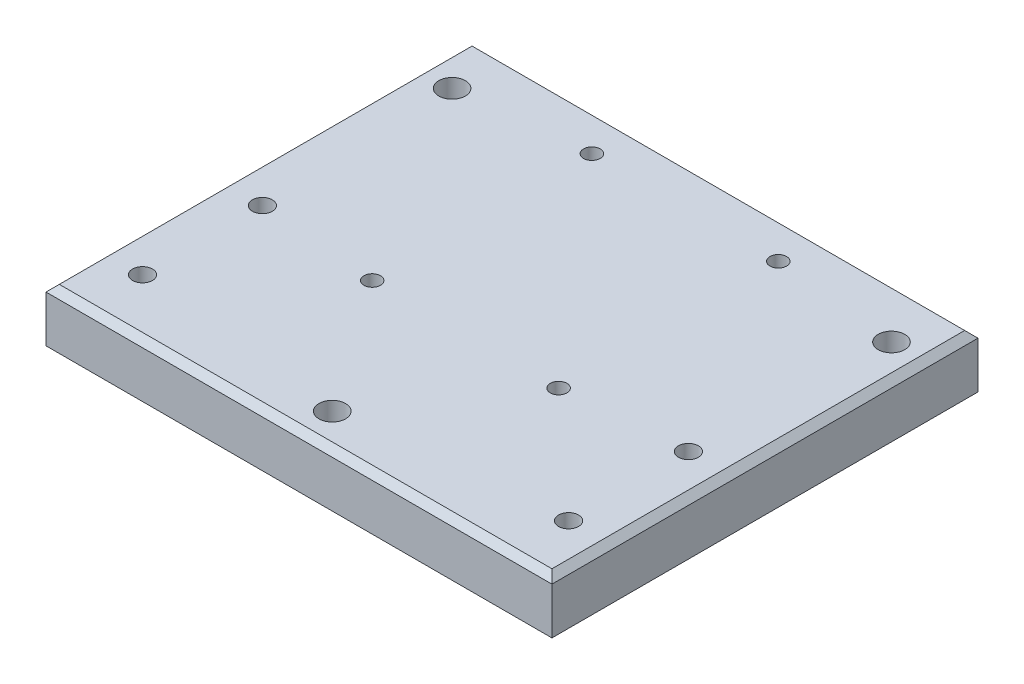
ISO-10303-21;
HEADER;
FILE_DESCRIPTION(('STEP AP214'),'2;1');
FILE_NAME('part.step','',(''),(''),'','','');
FILE_SCHEMA(('AUTOMOTIVE_DESIGN { 1 0 10303 214 1 1 1 1 }'));
ENDSEC;
DATA;
#1=APPLICATION_CONTEXT('core data for automotive mechanical design processes');
#2=APPLICATION_PROTOCOL_DEFINITION('international standard','automotive_design',2000,#1);
#3=PRODUCT_CONTEXT('',#1,'mechanical');
#4=PRODUCT('Part','Part','',(#3));
#5=PRODUCT_RELATED_PRODUCT_CATEGORY('part','',(#4));
#6=PRODUCT_DEFINITION_FORMATION('','',#4);
#7=PRODUCT_DEFINITION_CONTEXT('part definition',#1,'design');
#8=PRODUCT_DEFINITION('design','',#6,#7);
#9=PRODUCT_DEFINITION_SHAPE('','',#8);
#10=(LENGTH_UNIT() NAMED_UNIT(*) SI_UNIT(.MILLI.,.METRE.));
#11=(NAMED_UNIT(*) PLANE_ANGLE_UNIT() SI_UNIT($,.RADIAN.));
#12=(NAMED_UNIT(*) SI_UNIT($,.STERADIAN.) SOLID_ANGLE_UNIT());
#13=UNCERTAINTY_MEASURE_WITH_UNIT(LENGTH_MEASURE(1.E-05),#10,'distance_accuracy_value','');
#14=(GEOMETRIC_REPRESENTATION_CONTEXT(3) GLOBAL_UNCERTAINTY_ASSIGNED_CONTEXT((#13)) GLOBAL_UNIT_ASSIGNED_CONTEXT((#10,
#11,#12)) REPRESENTATION_CONTEXT('',''));
#15=CARTESIAN_POINT('',(0.,0.,0.));
#16=DIRECTION('',(0.,0.,1.));
#17=DIRECTION('',(1.,0.,0.));
#18=AXIS2_PLACEMENT_3D('',#15,#16,#17);
#19=CARTESIAN_POINT('',(38.,8.,-32.));
#20=DIRECTION('',(-1.,0.,0.));
#21=DIRECTION('',(0.,0.,1.));
#22=AXIS2_PLACEMENT_3D('',#19,#20,#21);
#23=PLANE('',#22);
#24=DIRECTION('',(0.,-1.,0.));
#25=VECTOR('',#24,1.);
#26=CARTESIAN_POINT('',(38.,8.,-32.));
#27=LINE('',#26,#25);
#28=CARTESIAN_POINT('',(38.,7.00000000000001,-32.));
#29=VERTEX_POINT('',#28);
#30=CARTESIAN_POINT('',(38.,0.,-32.));
#31=VERTEX_POINT('',#30);
#32=EDGE_CURVE('E88',#29,#31,#27,.T.);
#33=ORIENTED_EDGE('',*,*,#32,.F.);
#34=DIRECTION('',(0.,0.,1.));
#35=VECTOR('',#34,1.);
#36=CARTESIAN_POINT('',(38.,7.00000000000001,32.));
#37=LINE('',#36,#35);
#38=CARTESIAN_POINT('',(38.,7.00000000000001,32.));
#39=VERTEX_POINT('',#38);
#40=EDGE_CURVE('E133',#29,#39,#37,.T.);
#41=ORIENTED_EDGE('',*,*,#40,.T.);
#42=DIRECTION('',(0.,-1.,0.));
#43=VECTOR('',#42,1.);
#44=CARTESIAN_POINT('',(38.,8.,32.));
#45=LINE('',#44,#43);
#46=CARTESIAN_POINT('',(38.,0.,32.));
#47=VERTEX_POINT('',#46);
#48=EDGE_CURVE('E109',#39,#47,#45,.T.);
#49=ORIENTED_EDGE('',*,*,#48,.T.);
#50=DIRECTION('',(0.,0.,-1.));
#51=VECTOR('',#50,1.);
#52=CARTESIAN_POINT('',(38.,0.,-32.));
#53=LINE('',#52,#51);
#54=EDGE_CURVE('E105',#47,#31,#53,.T.);
#55=ORIENTED_EDGE('',*,*,#54,.T.);
#56=EDGE_LOOP('',(#33,#41,#49,#55));
#57=FACE_BOUND('',#56,.T.);
#58=ADVANCED_FACE('F34',(#57),#23,.F.);
#59=CARTESIAN_POINT('',(-38.,8.,-32.));
#60=DIRECTION('',(0.,0.,1.));
#61=DIRECTION('',(1.,0.,0.));
#62=AXIS2_PLACEMENT_3D('',#59,#60,#61);
#63=PLANE('',#62);
#64=DIRECTION('',(0.,-1.,0.));
#65=VECTOR('',#64,1.);
#66=CARTESIAN_POINT('',(-38.,8.,-32.));
#67=LINE('',#66,#65);
#68=CARTESIAN_POINT('',(-38.,7.00000000000001,-32.));
#69=VERTEX_POINT('',#68);
#70=CARTESIAN_POINT('',(-38.,0.,-32.));
#71=VERTEX_POINT('',#70);
#72=EDGE_CURVE('E99',#69,#71,#67,.T.);
#73=ORIENTED_EDGE('',*,*,#72,.F.);
#74=DIRECTION('',(1.,0.,0.));
#75=VECTOR('',#74,1.);
#76=CARTESIAN_POINT('',(38.,7.00000000000001,-32.));
#77=LINE('',#76,#75);
#78=EDGE_CURVE('E11',#69,#29,#77,.T.);
#79=ORIENTED_EDGE('',*,*,#78,.T.);
#80=ORIENTED_EDGE('',*,*,#32,.T.);
#81=DIRECTION('',(-1.,0.,0.));
#82=VECTOR('',#81,1.);
#83=CARTESIAN_POINT('',(-38.,0.,-32.));
#84=LINE('',#83,#82);
#85=EDGE_CURVE('E91',#31,#71,#84,.T.);
#86=ORIENTED_EDGE('',*,*,#85,.T.);
#87=EDGE_LOOP('',(#73,#79,#80,#86));
#88=FACE_BOUND('',#87,.T.);
#89=ADVANCED_FACE('F90',(#88),#63,.F.);
#90=CARTESIAN_POINT('',(-38.,8.,-32.));
#91=DIRECTION('',(1.,0.,0.));
#92=DIRECTION('',(0.,0.,-1.));
#93=AXIS2_PLACEMENT_3D('',#90,#91,#92);
#94=PLANE('',#93);
#95=DIRECTION('',(0.,-1.,0.));
#96=VECTOR('',#95,1.);
#97=CARTESIAN_POINT('',(-38.,8.,32.));
#98=LINE('',#97,#96);
#99=CARTESIAN_POINT('',(-38.,7.00000000000001,32.));
#100=VERTEX_POINT('',#99);
#101=CARTESIAN_POINT('',(-38.,0.,32.));
#102=VERTEX_POINT('',#101);
#103=EDGE_CURVE('E122',#100,#102,#98,.T.);
#104=ORIENTED_EDGE('',*,*,#103,.F.);
#105=DIRECTION('',(0.,0.,-1.));
#106=VECTOR('',#105,1.);
#107=CARTESIAN_POINT('',(-38.,7.00000000000001,-32.));
#108=LINE('',#107,#106);
#109=EDGE_CURVE('E43',#100,#69,#108,.T.);
#110=ORIENTED_EDGE('',*,*,#109,.T.);
#111=ORIENTED_EDGE('',*,*,#72,.T.);
#112=DIRECTION('',(0.,0.,1.));
#113=VECTOR('',#112,1.);
#114=CARTESIAN_POINT('',(-38.,0.,-32.));
#115=LINE('',#114,#113);
#116=EDGE_CURVE('E107',#71,#102,#115,.T.);
#117=ORIENTED_EDGE('',*,*,#116,.T.);
#118=EDGE_LOOP('',(#104,#110,#111,#117));
#119=FACE_BOUND('',#118,.T.);
#120=ADVANCED_FACE('F180',(#119),#94,.F.);
#121=CARTESIAN_POINT('',(-38.,8.,32.));
#122=DIRECTION('',(0.,0.,-1.));
#123=DIRECTION('',(-1.,0.,0.));
#124=AXIS2_PLACEMENT_3D('',#121,#122,#123);
#125=PLANE('',#124);
#126=ORIENTED_EDGE('',*,*,#48,.F.);
#127=DIRECTION('',(-1.,0.,0.));
#128=VECTOR('',#127,1.);
#129=CARTESIAN_POINT('',(-38.,7.00000000000001,32.));
#130=LINE('',#129,#128);
#131=EDGE_CURVE('E58',#39,#100,#130,.T.);
#132=ORIENTED_EDGE('',*,*,#131,.T.);
#133=ORIENTED_EDGE('',*,*,#103,.T.);
#134=DIRECTION('',(1.,0.,0.));
#135=VECTOR('',#134,1.);
#136=CARTESIAN_POINT('',(-38.,0.,32.));
#137=LINE('',#136,#135);
#138=EDGE_CURVE('E119',#102,#47,#137,.T.);
#139=ORIENTED_EDGE('',*,*,#138,.T.);
#140=EDGE_LOOP('',(#126,#132,#133,#139));
#141=FACE_BOUND('',#140,.T.);
#142=ADVANCED_FACE('F208',(#141),#125,.F.);
#143=CARTESIAN_POINT('',(0.,8.,0.));
#144=DIRECTION('',(0.,1.,0.));
#145=DIRECTION('',(0.,0.,1.));
#146=AXIS2_PLACEMENT_3D('',#143,#144,#145);
#147=PLANE('',#146);
#148=CARTESIAN_POINT('',(-32.,8.,5.5));
#149=DIRECTION('',(0.,1.,0.));
#150=DIRECTION('',(0.,0.,1.));
#151=AXIS2_PLACEMENT_3D('',#148,#149,#150);
#152=CIRCLE('',#151,1.5);
#153=CARTESIAN_POINT('',(-32.,8.,7.00000000000001));
#154=VERTEX_POINT('',#153);
#155=EDGE_CURVE('E315',#154,#154,#152,.T.);
#156=ORIENTED_EDGE('',*,*,#155,.F.);
#157=EDGE_LOOP('',(#156));
#158=FACE_BOUND('',#157,.T.);
#159=CARTESIAN_POINT('',(-32.,8.,23.5));
#160=DIRECTION('',(0.,1.,0.));
#161=DIRECTION('',(0.,0.,1.));
#162=AXIS2_PLACEMENT_3D('',#159,#160,#161);
#163=CIRCLE('',#162,1.5);
#164=CARTESIAN_POINT('',(-32.,8.,25.));
#165=VERTEX_POINT('',#164);
#166=EDGE_CURVE('E317',#165,#165,#163,.T.);
#167=ORIENTED_EDGE('',*,*,#166,.F.);
#168=EDGE_LOOP('',(#167));
#169=FACE_BOUND('',#168,.T.);
#170=CARTESIAN_POINT('',(32.,8.,23.5));
#171=DIRECTION('',(0.,1.,0.));
#172=DIRECTION('',(0.,0.,1.));
#173=AXIS2_PLACEMENT_3D('',#170,#171,#172);
#174=CIRCLE('',#173,1.50000000000001);
#175=CARTESIAN_POINT('',(32.,8.,25.));
#176=VERTEX_POINT('',#175);
#177=EDGE_CURVE('E314',#176,#176,#174,.T.);
#178=ORIENTED_EDGE('',*,*,#177,.F.);
#179=EDGE_LOOP('',(#178));
#180=FACE_BOUND('',#179,.T.);
#181=CARTESIAN_POINT('',(32.,8.,5.5));
#182=DIRECTION('',(0.,1.,0.));
#183=DIRECTION('',(0.,0.,1.));
#184=AXIS2_PLACEMENT_3D('',#181,#182,#183);
#185=CIRCLE('',#184,1.5);
#186=CARTESIAN_POINT('',(32.,8.,7.00000000000001));
#187=VERTEX_POINT('',#186);
#188=EDGE_CURVE('E152',#187,#187,#185,.T.);
#189=ORIENTED_EDGE('',*,*,#188,.F.);
#190=EDGE_LOOP('',(#189));
#191=FACE_BOUND('',#190,.T.);
#192=DIRECTION('',(1.,0.,0.));
#193=VECTOR('',#192,1.);
#194=CARTESIAN_POINT('',(38.,8.,31.));
#195=LINE('',#194,#193);
#196=CARTESIAN_POINT('',(-37.,8.,31.));
#197=VERTEX_POINT('',#196);
#198=CARTESIAN_POINT('',(37.,8.,31.));
#199=VERTEX_POINT('',#198);
#200=EDGE_CURVE('E128',#197,#199,#195,.T.);
#201=ORIENTED_EDGE('',*,*,#200,.T.);
#202=DIRECTION('',(0.,0.,-1.));
#203=VECTOR('',#202,1.);
#204=CARTESIAN_POINT('',(37.,8.,-32.));
#205=LINE('',#204,#203);
#206=CARTESIAN_POINT('',(37.,8.,-31.));
#207=VERTEX_POINT('',#206);
#208=EDGE_CURVE('E130',#199,#207,#205,.T.);
#209=ORIENTED_EDGE('',*,*,#208,.T.);
#210=DIRECTION('',(-1.,0.,0.));
#211=VECTOR('',#210,1.);
#212=CARTESIAN_POINT('',(-38.,8.,-31.));
#213=LINE('',#212,#211);
#214=CARTESIAN_POINT('',(-37.,8.,-31.));
#215=VERTEX_POINT('',#214);
#216=EDGE_CURVE('E98',#207,#215,#213,.T.);
#217=ORIENTED_EDGE('',*,*,#216,.T.);
#218=DIRECTION('',(0.,0.,1.));
#219=VECTOR('',#218,1.);
#220=CARTESIAN_POINT('',(-37.,8.,32.));
#221=LINE('',#220,#219);
#222=EDGE_CURVE('E126',#215,#197,#221,.T.);
#223=ORIENTED_EDGE('',*,*,#222,.T.);
#224=EDGE_LOOP('',(#201,#209,#217,#223));
#225=FACE_BOUND('',#224,.T.);
#226=CARTESIAN_POINT('',(33.,8.,-24.));
#227=DIRECTION('',(0.,1.,0.));
#228=DIRECTION('',(0.,0.,1.));
#229=AXIS2_PLACEMENT_3D('',#226,#227,#228);
#230=CIRCLE('',#229,2.);
#231=CARTESIAN_POINT('',(33.,8.,-22.));
#232=VERTEX_POINT('',#231);
#233=EDGE_CURVE('E309',#232,#232,#230,.T.);
#234=ORIENTED_EDGE('',*,*,#233,.F.);
#235=EDGE_LOOP('',(#234));
#236=FACE_BOUND('',#235,.T.);
#237=CARTESIAN_POINT('',(0.,8.,27.));
#238=DIRECTION('',(0.,1.,0.));
#239=DIRECTION('',(0.,0.,1.));
#240=AXIS2_PLACEMENT_3D('',#237,#238,#239);
#241=CIRCLE('',#240,2.);
#242=CARTESIAN_POINT('',(0.,8.,29.));
#243=VERTEX_POINT('',#242);
#244=EDGE_CURVE('E306',#243,#243,#241,.T.);
#245=ORIENTED_EDGE('',*,*,#244,.F.);
#246=EDGE_LOOP('',(#245));
#247=FACE_BOUND('',#246,.T.);
#248=CARTESIAN_POINT('',(-33.,8.,-24.));
#249=DIRECTION('',(0.,1.,0.));
#250=DIRECTION('',(0.,0.,1.));
#251=AXIS2_PLACEMENT_3D('',#248,#249,#250);
#252=CIRCLE('',#251,2.);
#253=CARTESIAN_POINT('',(-33.,8.,-22.));
#254=VERTEX_POINT('',#253);
#255=EDGE_CURVE('E302',#254,#254,#252,.T.);
#256=ORIENTED_EDGE('',*,*,#255,.F.);
#257=EDGE_LOOP('',(#256));
#258=FACE_BOUND('',#257,.T.);
#259=CARTESIAN_POINT('',(14.,8.,7.));
#260=DIRECTION('',(0.,1.,0.));
#261=DIRECTION('',(0.,0.,1.));
#262=AXIS2_PLACEMENT_3D('',#259,#260,#261);
#263=CIRCLE('',#262,1.24999999999999);
#264=CARTESIAN_POINT('',(14.,8.,8.24999999999999));
#265=VERTEX_POINT('',#264);
#266=EDGE_CURVE('E298',#265,#265,#263,.T.);
#267=ORIENTED_EDGE('',*,*,#266,.F.);
#268=EDGE_LOOP('',(#267));
#269=FACE_BOUND('',#268,.T.);
#270=CARTESIAN_POINT('',(14.,8.,-26.));
#271=DIRECTION('',(0.,1.,0.));
#272=DIRECTION('',(0.,0.,1.));
#273=AXIS2_PLACEMENT_3D('',#270,#271,#272);
#274=CIRCLE('',#273,1.24999999999999);
#275=CARTESIAN_POINT('',(14.,8.,-24.75));
#276=VERTEX_POINT('',#275);
#277=EDGE_CURVE('E294',#276,#276,#274,.T.);
#278=ORIENTED_EDGE('',*,*,#277,.F.);
#279=EDGE_LOOP('',(#278));
#280=FACE_BOUND('',#279,.T.);
#281=CARTESIAN_POINT('',(-14.,8.,7.));
#282=DIRECTION('',(0.,1.,0.));
#283=DIRECTION('',(0.,0.,1.));
#284=AXIS2_PLACEMENT_3D('',#281,#282,#283);
#285=CIRCLE('',#284,1.24999999999999);
#286=CARTESIAN_POINT('',(-14.,8.,8.24999999999999));
#287=VERTEX_POINT('',#286);
#288=EDGE_CURVE('E288',#287,#287,#285,.T.);
#289=ORIENTED_EDGE('',*,*,#288,.F.);
#290=EDGE_LOOP('',(#289));
#291=FACE_BOUND('',#290,.T.);
#292=CARTESIAN_POINT('',(-14.,8.,-26.));
#293=DIRECTION('',(0.,1.,0.));
#294=DIRECTION('',(0.,0.,1.));
#295=AXIS2_PLACEMENT_3D('',#292,#293,#294);
#296=CIRCLE('',#295,1.24999999999999);
#297=CARTESIAN_POINT('',(-14.,8.,-24.75));
#298=VERTEX_POINT('',#297);
#299=EDGE_CURVE('E114',#298,#298,#296,.T.);
#300=ORIENTED_EDGE('',*,*,#299,.F.);
#301=EDGE_LOOP('',(#300));
#302=FACE_BOUND('',#301,.T.);
#303=ADVANCED_FACE('F213',(#158,#169,#180,#191,#225,#236,#247,#258,#269,#280,#291,#302),#147,.T.);
#304=CARTESIAN_POINT('',(0.,0.,0.));
#305=DIRECTION('',(0.,1.,0.));
#306=DIRECTION('',(0.,0.,1.));
#307=AXIS2_PLACEMENT_3D('',#304,#305,#306);
#308=PLANE('',#307);
#309=CARTESIAN_POINT('',(-32.,0.,5.5));
#310=DIRECTION('',(0.,1.,0.));
#311=DIRECTION('',(0.,0.,1.));
#312=AXIS2_PLACEMENT_3D('',#309,#310,#311);
#313=CIRCLE('',#312,1.5);
#314=CARTESIAN_POINT('',(-32.,0.,7.00000000000001));
#315=VERTEX_POINT('',#314);
#316=EDGE_CURVE('E38',#315,#315,#313,.T.);
#317=ORIENTED_EDGE('',*,*,#316,.T.);
#318=EDGE_LOOP('',(#317));
#319=FACE_BOUND('',#318,.T.);
#320=CARTESIAN_POINT('',(-32.,0.,23.5));
#321=DIRECTION('',(0.,1.,0.));
#322=DIRECTION('',(0.,0.,1.));
#323=AXIS2_PLACEMENT_3D('',#320,#321,#322);
#324=CIRCLE('',#323,1.5);
#325=CARTESIAN_POINT('',(-32.,0.,25.));
#326=VERTEX_POINT('',#325);
#327=EDGE_CURVE('E154',#326,#326,#324,.T.);
#328=ORIENTED_EDGE('',*,*,#327,.T.);
#329=EDGE_LOOP('',(#328));
#330=FACE_BOUND('',#329,.T.);
#331=CARTESIAN_POINT('',(32.,0.,23.5));
#332=DIRECTION('',(0.,1.,0.));
#333=DIRECTION('',(0.,0.,1.));
#334=AXIS2_PLACEMENT_3D('',#331,#332,#333);
#335=CIRCLE('',#334,1.50000000000001);
#336=CARTESIAN_POINT('',(32.,0.,25.));
#337=VERTEX_POINT('',#336);
#338=EDGE_CURVE('E151',#337,#337,#335,.T.);
#339=ORIENTED_EDGE('',*,*,#338,.T.);
#340=EDGE_LOOP('',(#339));
#341=FACE_BOUND('',#340,.T.);
#342=CARTESIAN_POINT('',(32.,0.,5.5));
#343=DIRECTION('',(0.,1.,0.));
#344=DIRECTION('',(0.,0.,1.));
#345=AXIS2_PLACEMENT_3D('',#342,#343,#344);
#346=CIRCLE('',#345,1.5);
#347=CARTESIAN_POINT('',(32.,0.,7.00000000000001));
#348=VERTEX_POINT('',#347);
#349=EDGE_CURVE('E148',#348,#348,#346,.T.);
#350=ORIENTED_EDGE('',*,*,#349,.T.);
#351=EDGE_LOOP('',(#350));
#352=FACE_BOUND('',#351,.T.);
#353=CARTESIAN_POINT('',(33.,0.,-24.));
#354=DIRECTION('',(0.,1.,0.));
#355=DIRECTION('',(0.,0.,1.));
#356=AXIS2_PLACEMENT_3D('',#353,#354,#355);
#357=CIRCLE('',#356,2.);
#358=CARTESIAN_POINT('',(33.,0.,-22.));
#359=VERTEX_POINT('',#358);
#360=EDGE_CURVE('E263',#359,#359,#357,.T.);
#361=ORIENTED_EDGE('',*,*,#360,.T.);
#362=EDGE_LOOP('',(#361));
#363=FACE_BOUND('',#362,.T.);
#364=CARTESIAN_POINT('',(0.,0.,27.));
#365=DIRECTION('',(0.,1.,0.));
#366=DIRECTION('',(0.,0.,1.));
#367=AXIS2_PLACEMENT_3D('',#364,#365,#366);
#368=CIRCLE('',#367,2.);
#369=CARTESIAN_POINT('',(0.,0.,29.));
#370=VERTEX_POINT('',#369);
#371=EDGE_CURVE('E267',#370,#370,#368,.T.);
#372=ORIENTED_EDGE('',*,*,#371,.T.);
#373=EDGE_LOOP('',(#372));
#374=FACE_BOUND('',#373,.T.);
#375=CARTESIAN_POINT('',(-33.,0.,-24.));
#376=DIRECTION('',(0.,1.,0.));
#377=DIRECTION('',(0.,0.,1.));
#378=AXIS2_PLACEMENT_3D('',#375,#376,#377);
#379=CIRCLE('',#378,2.);
#380=CARTESIAN_POINT('',(-33.,0.,-22.));
#381=VERTEX_POINT('',#380);
#382=EDGE_CURVE('E147',#381,#381,#379,.T.);
#383=ORIENTED_EDGE('',*,*,#382,.T.);
#384=EDGE_LOOP('',(#383));
#385=FACE_BOUND('',#384,.T.);
#386=CARTESIAN_POINT('',(14.,0.,7.));
#387=DIRECTION('',(0.,1.,0.));
#388=DIRECTION('',(0.,0.,1.));
#389=AXIS2_PLACEMENT_3D('',#386,#387,#388);
#390=CIRCLE('',#389,1.25);
#391=CARTESIAN_POINT('',(14.,0.,8.25));
#392=VERTEX_POINT('',#391);
#393=EDGE_CURVE('E274',#392,#392,#390,.T.);
#394=ORIENTED_EDGE('',*,*,#393,.T.);
#395=EDGE_LOOP('',(#394));
#396=FACE_BOUND('',#395,.T.);
#397=CARTESIAN_POINT('',(14.,0.,-26.));
#398=DIRECTION('',(0.,1.,0.));
#399=DIRECTION('',(0.,0.,1.));
#400=AXIS2_PLACEMENT_3D('',#397,#398,#399);
#401=CIRCLE('',#400,1.25);
#402=CARTESIAN_POINT('',(14.,0.,-24.75));
#403=VERTEX_POINT('',#402);
#404=EDGE_CURVE('E278',#403,#403,#401,.T.);
#405=ORIENTED_EDGE('',*,*,#404,.T.);
#406=EDGE_LOOP('',(#405));
#407=FACE_BOUND('',#406,.T.);
#408=CARTESIAN_POINT('',(-14.,0.,7.));
#409=DIRECTION('',(0.,1.,0.));
#410=DIRECTION('',(0.,0.,1.));
#411=AXIS2_PLACEMENT_3D('',#408,#409,#410);
#412=CIRCLE('',#411,1.25);
#413=CARTESIAN_POINT('',(-14.,0.,8.25));
#414=VERTEX_POINT('',#413);
#415=EDGE_CURVE('E282',#414,#414,#412,.T.);
#416=ORIENTED_EDGE('',*,*,#415,.T.);
#417=EDGE_LOOP('',(#416));
#418=FACE_BOUND('',#417,.T.);
#419=CARTESIAN_POINT('',(-14.,0.,-26.));
#420=DIRECTION('',(0.,1.,0.));
#421=DIRECTION('',(0.,0.,1.));
#422=AXIS2_PLACEMENT_3D('',#419,#420,#421);
#423=CIRCLE('',#422,1.25);
#424=CARTESIAN_POINT('',(-14.,0.,-24.75));
#425=VERTEX_POINT('',#424);
#426=EDGE_CURVE('E111',#425,#425,#423,.T.);
#427=ORIENTED_EDGE('',*,*,#426,.T.);
#428=EDGE_LOOP('',(#427));
#429=FACE_BOUND('',#428,.T.);
#430=ORIENTED_EDGE('',*,*,#54,.F.);
#431=ORIENTED_EDGE('',*,*,#138,.F.);
#432=ORIENTED_EDGE('',*,*,#116,.F.);
#433=ORIENTED_EDGE('',*,*,#85,.F.);
#434=EDGE_LOOP('',(#430,#431,#432,#433));
#435=FACE_BOUND('',#434,.T.);
#436=ADVANCED_FACE('F103',(#319,#330,#341,#352,#363,#374,#385,#396,#407,#418,#429,#435),#308,.F.);
#437=CARTESIAN_POINT('',(-14.,8.,-26.));
#438=DIRECTION('',(0.,1.,0.));
#439=DIRECTION('',(0.,0.,1.));
#440=AXIS2_PLACEMENT_3D('',#437,#438,#439);
#441=CYLINDRICAL_SURFACE('',#440,1.24999999999999);
#442=ORIENTED_EDGE('',*,*,#426,.F.);
#443=EDGE_LOOP('',(#442));
#444=FACE_BOUND('',#443,.T.);
#445=ORIENTED_EDGE('',*,*,#299,.T.);
#446=EDGE_LOOP('',(#445));
#447=FACE_BOUND('',#446,.T.);
#448=ADVANCED_FACE('F218',(#444,#447),#441,.F.);
#449=CARTESIAN_POINT('',(-14.,8.,7.));
#450=DIRECTION('',(0.,1.,0.));
#451=DIRECTION('',(0.,0.,1.));
#452=AXIS2_PLACEMENT_3D('',#449,#450,#451);
#453=CYLINDRICAL_SURFACE('',#452,1.24999999999999);
#454=ORIENTED_EDGE('',*,*,#415,.F.);
#455=EDGE_LOOP('',(#454));
#456=FACE_BOUND('',#455,.T.);
#457=ORIENTED_EDGE('',*,*,#288,.T.);
#458=EDGE_LOOP('',(#457));
#459=FACE_BOUND('',#458,.T.);
#460=ADVANCED_FACE('F224',(#456,#459),#453,.F.);
#461=CARTESIAN_POINT('',(14.,8.,-26.));
#462=DIRECTION('',(0.,1.,0.));
#463=DIRECTION('',(0.,0.,1.));
#464=AXIS2_PLACEMENT_3D('',#461,#462,#463);
#465=CYLINDRICAL_SURFACE('',#464,1.24999999999999);
#466=ORIENTED_EDGE('',*,*,#404,.F.);
#467=EDGE_LOOP('',(#466));
#468=FACE_BOUND('',#467,.T.);
#469=ORIENTED_EDGE('',*,*,#277,.T.);
#470=EDGE_LOOP('',(#469));
#471=FACE_BOUND('',#470,.T.);
#472=ADVANCED_FACE('F228',(#468,#471),#465,.F.);
#473=CARTESIAN_POINT('',(14.,8.,7.));
#474=DIRECTION('',(0.,1.,0.));
#475=DIRECTION('',(0.,0.,1.));
#476=AXIS2_PLACEMENT_3D('',#473,#474,#475);
#477=CYLINDRICAL_SURFACE('',#476,1.24999999999999);
#478=ORIENTED_EDGE('',*,*,#393,.F.);
#479=EDGE_LOOP('',(#478));
#480=FACE_BOUND('',#479,.T.);
#481=ORIENTED_EDGE('',*,*,#266,.T.);
#482=EDGE_LOOP('',(#481));
#483=FACE_BOUND('',#482,.T.);
#484=ADVANCED_FACE('F232',(#480,#483),#477,.F.);
#485=CARTESIAN_POINT('',(-33.,0.,-24.));
#486=DIRECTION('',(0.,1.,0.));
#487=DIRECTION('',(0.,0.,1.));
#488=AXIS2_PLACEMENT_3D('',#485,#486,#487);
#489=CYLINDRICAL_SURFACE('',#488,2.);
#490=ORIENTED_EDGE('',*,*,#382,.F.);
#491=EDGE_LOOP('',(#490));
#492=FACE_BOUND('',#491,.T.);
#493=ORIENTED_EDGE('',*,*,#255,.T.);
#494=EDGE_LOOP('',(#493));
#495=FACE_BOUND('',#494,.T.);
#496=ADVANCED_FACE('F236',(#492,#495),#489,.F.);
#497=CARTESIAN_POINT('',(0.,0.,27.));
#498=DIRECTION('',(0.,1.,0.));
#499=DIRECTION('',(0.,0.,1.));
#500=AXIS2_PLACEMENT_3D('',#497,#498,#499);
#501=CYLINDRICAL_SURFACE('',#500,2.);
#502=ORIENTED_EDGE('',*,*,#371,.F.);
#503=EDGE_LOOP('',(#502));
#504=FACE_BOUND('',#503,.T.);
#505=ORIENTED_EDGE('',*,*,#244,.T.);
#506=EDGE_LOOP('',(#505));
#507=FACE_BOUND('',#506,.T.);
#508=ADVANCED_FACE('F240',(#504,#507),#501,.F.);
#509=CARTESIAN_POINT('',(33.,0.,-24.));
#510=DIRECTION('',(0.,1.,0.));
#511=DIRECTION('',(0.,0.,1.));
#512=AXIS2_PLACEMENT_3D('',#509,#510,#511);
#513=CYLINDRICAL_SURFACE('',#512,2.);
#514=ORIENTED_EDGE('',*,*,#360,.F.);
#515=EDGE_LOOP('',(#514));
#516=FACE_BOUND('',#515,.T.);
#517=ORIENTED_EDGE('',*,*,#233,.T.);
#518=EDGE_LOOP('',(#517));
#519=FACE_BOUND('',#518,.T.);
#520=ADVANCED_FACE('F198',(#516,#519),#513,.F.);
#521=CARTESIAN_POINT('',(-37.,8.,0.));
#522=DIRECTION('',(-0.707106781186547,0.707106781186547,0.));
#523=DIRECTION('',(0.,0.,-1.));
#524=AXIS2_PLACEMENT_3D('',#521,#522,#523);
#525=PLANE('',#524);
#526=DIRECTION('',(0.577350269189626,0.577350269189626,0.577350269189626));
#527=VECTOR('',#526,1.);
#528=CARTESIAN_POINT('',(-24.6666666666667,20.3333333333333,-18.6666666666667));
#529=LINE('',#528,#527);
#530=EDGE_CURVE('E141',#69,#215,#529,.T.);
#531=ORIENTED_EDGE('',*,*,#530,.F.);
#532=ORIENTED_EDGE('',*,*,#109,.F.);
#533=DIRECTION('',(0.577350269189626,0.577350269189626,-0.577350269189626));
#534=VECTOR('',#533,1.);
#535=CARTESIAN_POINT('',(-26.6666666666667,18.3333333333333,20.6666666666667));
#536=LINE('',#535,#534);
#537=EDGE_CURVE('E144',#197,#100,#536,.F.);
#538=ORIENTED_EDGE('',*,*,#537,.F.);
#539=ORIENTED_EDGE('',*,*,#222,.F.);
#540=EDGE_LOOP('',(#531,#532,#538,#539));
#541=FACE_BOUND('',#540,.T.);
#542=ADVANCED_FACE('F36',(#541),#525,.T.);
#543=CARTESIAN_POINT('',(0.,8.,31.));
#544=DIRECTION('',(0.,0.707106781186547,0.707106781186547));
#545=DIRECTION('',(-1.,0.,0.));
#546=AXIS2_PLACEMENT_3D('',#543,#544,#545);
#547=PLANE('',#546);
#548=ORIENTED_EDGE('',*,*,#537,.T.);
#549=ORIENTED_EDGE('',*,*,#131,.F.);
#550=DIRECTION('',(-0.577350269189626,0.577350269189626,-0.577350269189626));
#551=VECTOR('',#550,1.);
#552=CARTESIAN_POINT('',(24.6666666666667,20.3333333333333,18.6666666666667));
#553=LINE('',#552,#551);
#554=EDGE_CURVE('E139',#199,#39,#553,.F.);
#555=ORIENTED_EDGE('',*,*,#554,.F.);
#556=ORIENTED_EDGE('',*,*,#200,.F.);
#557=EDGE_LOOP('',(#548,#549,#555,#556));
#558=FACE_BOUND('',#557,.T.);
#559=ADVANCED_FACE('F191',(#558),#547,.T.);
#560=CARTESIAN_POINT('',(0.,8.,-31.));
#561=DIRECTION('',(0.,0.707106781186547,-0.707106781186547));
#562=DIRECTION('',(1.,0.,0.));
#563=AXIS2_PLACEMENT_3D('',#560,#561,#562);
#564=PLANE('',#563);
#565=ORIENTED_EDGE('',*,*,#530,.T.);
#566=ORIENTED_EDGE('',*,*,#216,.F.);
#567=DIRECTION('',(0.577350269189626,-0.577350269189626,-0.577350269189626));
#568=VECTOR('',#567,1.);
#569=CARTESIAN_POINT('',(24.6666666666667,20.3333333333333,-18.6666666666667));
#570=LINE('',#569,#568);
#571=EDGE_CURVE('E137',#29,#207,#570,.F.);
#572=ORIENTED_EDGE('',*,*,#571,.F.);
#573=ORIENTED_EDGE('',*,*,#78,.F.);
#574=EDGE_LOOP('',(#565,#566,#572,#573));
#575=FACE_BOUND('',#574,.T.);
#576=ADVANCED_FACE('F188',(#575),#564,.T.);
#577=CARTESIAN_POINT('',(37.,8.,0.));
#578=DIRECTION('',(0.707106781186547,0.707106781186547,0.));
#579=DIRECTION('',(0.,0.,1.));
#580=AXIS2_PLACEMENT_3D('',#577,#578,#579);
#581=PLANE('',#580);
#582=ORIENTED_EDGE('',*,*,#554,.T.);
#583=ORIENTED_EDGE('',*,*,#40,.F.);
#584=ORIENTED_EDGE('',*,*,#571,.T.);
#585=ORIENTED_EDGE('',*,*,#208,.F.);
#586=EDGE_LOOP('',(#582,#583,#584,#585));
#587=FACE_BOUND('',#586,.T.);
#588=ADVANCED_FACE('F184',(#587),#581,.T.);
#589=CARTESIAN_POINT('',(32.,-2.,5.5));
#590=DIRECTION('',(0.,1.,0.));
#591=DIRECTION('',(0.,0.,1.));
#592=AXIS2_PLACEMENT_3D('',#589,#590,#591);
#593=CYLINDRICAL_SURFACE('',#592,1.5);
#594=ORIENTED_EDGE('',*,*,#188,.T.);
#595=EDGE_LOOP('',(#594));
#596=FACE_BOUND('',#595,.T.);
#597=ORIENTED_EDGE('',*,*,#349,.F.);
#598=EDGE_LOOP('',(#597));
#599=FACE_BOUND('',#598,.T.);
#600=ADVANCED_FACE('F187',(#596,#599),#593,.F.);
#601=CARTESIAN_POINT('',(32.,-2.,23.5));
#602=DIRECTION('',(0.,1.,0.));
#603=DIRECTION('',(0.,0.,1.));
#604=AXIS2_PLACEMENT_3D('',#601,#602,#603);
#605=CYLINDRICAL_SURFACE('',#604,1.50000000000001);
#606=ORIENTED_EDGE('',*,*,#177,.T.);
#607=EDGE_LOOP('',(#606));
#608=FACE_BOUND('',#607,.T.);
#609=ORIENTED_EDGE('',*,*,#338,.F.);
#610=EDGE_LOOP('',(#609));
#611=FACE_BOUND('',#610,.T.);
#612=ADVANCED_FACE('F170',(#608,#611),#605,.F.);
#613=CARTESIAN_POINT('',(-32.,-2.,23.5));
#614=DIRECTION('',(0.,1.,0.));
#615=DIRECTION('',(0.,0.,1.));
#616=AXIS2_PLACEMENT_3D('',#613,#614,#615);
#617=CYLINDRICAL_SURFACE('',#616,1.5);
#618=ORIENTED_EDGE('',*,*,#166,.T.);
#619=EDGE_LOOP('',(#618));
#620=FACE_BOUND('',#619,.T.);
#621=ORIENTED_EDGE('',*,*,#327,.F.);
#622=EDGE_LOOP('',(#621));
#623=FACE_BOUND('',#622,.T.);
#624=ADVANCED_FACE('F164',(#620,#623),#617,.F.);
#625=CARTESIAN_POINT('',(-32.,-2.,5.5));
#626=DIRECTION('',(0.,1.,0.));
#627=DIRECTION('',(0.,0.,1.));
#628=AXIS2_PLACEMENT_3D('',#625,#626,#627);
#629=CYLINDRICAL_SURFACE('',#628,1.5);
#630=ORIENTED_EDGE('',*,*,#155,.T.);
#631=EDGE_LOOP('',(#630));
#632=FACE_BOUND('',#631,.T.);
#633=ORIENTED_EDGE('',*,*,#316,.F.);
#634=EDGE_LOOP('',(#633));
#635=FACE_BOUND('',#634,.T.);
#636=ADVANCED_FACE('F162',(#632,#635),#629,.F.);
#637=CLOSED_SHELL('',(#58,#89,#120,#142,#303,#436,#448,#460,#472,#484,#496,#508,#520,#542,#559,
#576,#588,#600,#612,#624,#636));
#638=MANIFOLD_SOLID_BREP('B2',#637);
#639=ADVANCED_BREP_SHAPE_REPRESENTATION('',(#18,#638),#14);
#640=SHAPE_DEFINITION_REPRESENTATION(#9,#639);
ENDSEC;
END-ISO-10303-21;
